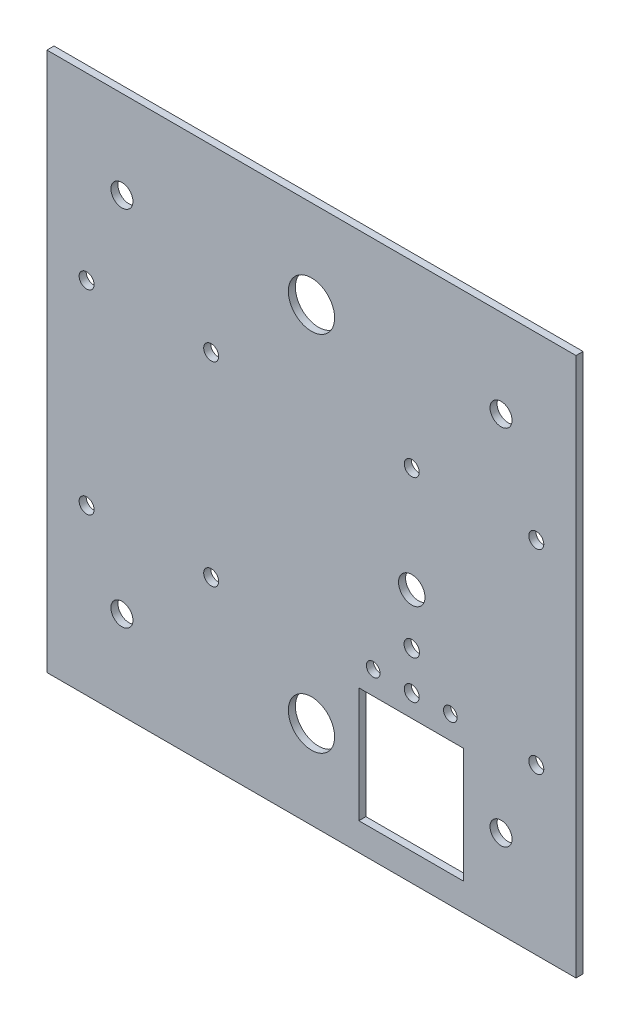
ISO-10303-21;
HEADER;
FILE_DESCRIPTION(('STEP AP214'),'2;1');
FILE_NAME('part.step','',(''),(''),'','','');
FILE_SCHEMA(('AUTOMOTIVE_DESIGN { 1 0 10303 214 1 1 1 1 }'));
ENDSEC;
DATA;
#1=APPLICATION_CONTEXT('core data for automotive mechanical design processes');
#2=APPLICATION_PROTOCOL_DEFINITION('international standard','automotive_design',2000,#1);
#3=PRODUCT_CONTEXT('',#1,'mechanical');
#4=PRODUCT('Part','Part','',(#3));
#5=PRODUCT_RELATED_PRODUCT_CATEGORY('part','',(#4));
#6=PRODUCT_DEFINITION_FORMATION('','',#4);
#7=PRODUCT_DEFINITION_CONTEXT('part definition',#1,'design');
#8=PRODUCT_DEFINITION('design','',#6,#7);
#9=PRODUCT_DEFINITION_SHAPE('','',#8);
#10=(LENGTH_UNIT() NAMED_UNIT(*) SI_UNIT(.MILLI.,.METRE.));
#11=(NAMED_UNIT(*) PLANE_ANGLE_UNIT() SI_UNIT($,.RADIAN.));
#12=(NAMED_UNIT(*) SI_UNIT($,.STERADIAN.) SOLID_ANGLE_UNIT());
#13=UNCERTAINTY_MEASURE_WITH_UNIT(LENGTH_MEASURE(1.E-05),#10,'distance_accuracy_value','');
#14=(GEOMETRIC_REPRESENTATION_CONTEXT(3) GLOBAL_UNCERTAINTY_ASSIGNED_CONTEXT((#13)) GLOBAL_UNIT_ASSIGNED_CONTEXT((#10,
#11,#12)) REPRESENTATION_CONTEXT('',''));
#15=CARTESIAN_POINT('',(0.,0.,0.));
#16=DIRECTION('',(0.,0.,1.));
#17=DIRECTION('',(1.,0.,0.));
#18=AXIS2_PLACEMENT_3D('',#15,#16,#17);
#19=CARTESIAN_POINT('',(-60.,60.,12.));
#20=DIRECTION('',(1.,0.,0.));
#21=DIRECTION('',(0.,-1.,0.));
#22=AXIS2_PLACEMENT_3D('',#19,#20,#21);
#23=PLANE('',#22);
#24=DIRECTION('',(0.,-1.,0.));
#25=VECTOR('',#24,1.);
#26=CARTESIAN_POINT('',(-60.,60.,12.));
#27=LINE('',#26,#25);
#28=CARTESIAN_POINT('',(-60.,91.1415926535898,12.));
#29=VERTEX_POINT('',#28);
#30=CARTESIAN_POINT('',(-60.,-31.1415926535898,12.));
#31=VERTEX_POINT('',#30);
#32=EDGE_CURVE('E177',#29,#31,#27,.T.);
#33=ORIENTED_EDGE('',*,*,#32,.T.);
#34=DIRECTION('',(0.,0.,-1.));
#35=VECTOR('',#34,1.);
#36=CARTESIAN_POINT('',(-60.,-31.1415926535898,12.));
#37=LINE('',#36,#35);
#38=CARTESIAN_POINT('',(-60.,-31.1415926535898,13.6));
#39=VERTEX_POINT('',#38);
#40=EDGE_CURVE('E202',#39,#31,#37,.T.);
#41=ORIENTED_EDGE('',*,*,#40,.F.);
#42=DIRECTION('',(0.,1.,0.));
#43=VECTOR('',#42,1.);
#44=CARTESIAN_POINT('',(-60.,60.,13.6));
#45=LINE('',#44,#43);
#46=CARTESIAN_POINT('',(-60.,91.1415926535898,13.6));
#47=VERTEX_POINT('',#46);
#48=EDGE_CURVE('E299',#47,#39,#45,.F.);
#49=ORIENTED_EDGE('',*,*,#48,.F.);
#50=DIRECTION('',(0.,0.,-1.));
#51=VECTOR('',#50,1.);
#52=CARTESIAN_POINT('',(-60.,91.1415926535898,12.));
#53=LINE('',#52,#51);
#54=EDGE_CURVE('E234',#47,#29,#53,.T.);
#55=ORIENTED_EDGE('',*,*,#54,.T.);
#56=EDGE_LOOP('',(#33,#41,#49,#55));
#57=FACE_BOUND('',#56,.T.);
#58=ADVANCED_FACE('F48',(#57),#23,.F.);
#59=CARTESIAN_POINT('',(60.,60.,12.));
#60=DIRECTION('',(1.,0.,0.));
#61=DIRECTION('',(0.,-1.,0.));
#62=AXIS2_PLACEMENT_3D('',#59,#60,#61);
#63=PLANE('',#62);
#64=DIRECTION('',(0.,-1.,0.));
#65=VECTOR('',#64,1.);
#66=CARTESIAN_POINT('',(60.,60.,12.));
#67=LINE('',#66,#65);
#68=CARTESIAN_POINT('',(60.,91.1415926535898,12.));
#69=VERTEX_POINT('',#68);
#70=CARTESIAN_POINT('',(60.,-31.1415926535898,12.));
#71=VERTEX_POINT('',#70);
#72=EDGE_CURVE('E182',#69,#71,#67,.T.);
#73=ORIENTED_EDGE('',*,*,#72,.F.);
#74=DIRECTION('',(0.,0.,-1.));
#75=VECTOR('',#74,1.);
#76=CARTESIAN_POINT('',(60.,91.1415926535898,12.));
#77=LINE('',#76,#75);
#78=CARTESIAN_POINT('',(60.,91.1415926535898,13.6));
#79=VERTEX_POINT('',#78);
#80=EDGE_CURVE('E267',#79,#69,#77,.T.);
#81=ORIENTED_EDGE('',*,*,#80,.F.);
#82=DIRECTION('',(0.,1.,0.));
#83=VECTOR('',#82,1.);
#84=CARTESIAN_POINT('',(60.,60.,13.6));
#85=LINE('',#84,#83);
#86=CARTESIAN_POINT('',(60.,-31.1415926535898,13.6));
#87=VERTEX_POINT('',#86);
#88=EDGE_CURVE('E287',#79,#87,#85,.F.);
#89=ORIENTED_EDGE('',*,*,#88,.T.);
#90=DIRECTION('',(0.,0.,-1.));
#91=VECTOR('',#90,1.);
#92=CARTESIAN_POINT('',(60.,-31.1415926535898,12.));
#93=LINE('',#92,#91);
#94=EDGE_CURVE('E201',#87,#71,#93,.T.);
#95=ORIENTED_EDGE('',*,*,#94,.T.);
#96=EDGE_LOOP('',(#73,#81,#89,#95));
#97=FACE_BOUND('',#96,.T.);
#98=ADVANCED_FACE('F285',(#97),#63,.T.);
#99=CARTESIAN_POINT('',(51.0000000000001,50.4,12.));
#100=DIRECTION('',(0.,0.,-1.));
#101=DIRECTION('',(-1.,0.,0.));
#102=AXIS2_PLACEMENT_3D('',#99,#100,#101);
#103=CYLINDRICAL_SURFACE('',#102,1.70000000000001);
#104=CARTESIAN_POINT('',(51.0000000000001,50.4,12.));
#105=DIRECTION('',(0.,0.,-1.));
#106=DIRECTION('',(-1.,0.,0.));
#107=AXIS2_PLACEMENT_3D('',#104,#105,#106);
#108=CIRCLE('',#107,1.70000000000001);
#109=CARTESIAN_POINT('',(49.3000000000001,50.4,12.));
#110=VERTEX_POINT('',#109);
#111=EDGE_CURVE('E157',#110,#110,#108,.F.);
#112=ORIENTED_EDGE('',*,*,#111,.F.);
#113=EDGE_LOOP('',(#112));
#114=FACE_BOUND('',#113,.T.);
#115=CARTESIAN_POINT('',(51.0000000000001,50.4,13.6));
#116=DIRECTION('',(0.,0.,-1.));
#117=DIRECTION('',(-1.,0.,0.));
#118=AXIS2_PLACEMENT_3D('',#115,#116,#117);
#119=CIRCLE('',#118,1.70000000000001);
#120=CARTESIAN_POINT('',(49.3000000000001,50.4,13.6));
#121=VERTEX_POINT('',#120);
#122=EDGE_CURVE('E274',#121,#121,#119,.F.);
#123=ORIENTED_EDGE('',*,*,#122,.T.);
#124=EDGE_LOOP('',(#123));
#125=FACE_BOUND('',#124,.T.);
#126=ADVANCED_FACE('F370',(#114,#125),#103,.F.);
#127=CARTESIAN_POINT('',(-22.7499999999999,6.2,12.));
#128=DIRECTION('',(0.,0.,-1.));
#129=DIRECTION('',(-1.,0.,0.));
#130=AXIS2_PLACEMENT_3D('',#127,#128,#129);
#131=CYLINDRICAL_SURFACE('',#130,1.70000000000001);
#132=CARTESIAN_POINT('',(-22.7499999999999,6.2,12.));
#133=DIRECTION('',(0.,0.,1.));
#134=DIRECTION('',(1.,0.,0.));
#135=AXIS2_PLACEMENT_3D('',#132,#133,#134);
#136=CIRCLE('',#135,1.70000000000001);
#137=CARTESIAN_POINT('',(-21.0499999999999,6.2,12.));
#138=VERTEX_POINT('',#137);
#139=EDGE_CURVE('E151',#138,#138,#136,.T.);
#140=ORIENTED_EDGE('',*,*,#139,.F.);
#141=EDGE_LOOP('',(#140));
#142=FACE_BOUND('',#141,.T.);
#143=CARTESIAN_POINT('',(-22.7499999999999,6.2,13.6));
#144=DIRECTION('',(0.,0.,1.));
#145=DIRECTION('',(1.,0.,0.));
#146=AXIS2_PLACEMENT_3D('',#143,#144,#145);
#147=CIRCLE('',#146,1.70000000000001);
#148=CARTESIAN_POINT('',(-21.0499999999999,6.2,13.6));
#149=VERTEX_POINT('',#148);
#150=EDGE_CURVE('E310',#149,#149,#147,.T.);
#151=ORIENTED_EDGE('',*,*,#150,.T.);
#152=EDGE_LOOP('',(#151));
#153=FACE_BOUND('',#152,.T.);
#154=ADVANCED_FACE('F376',(#142,#153),#131,.F.);
#155=CARTESIAN_POINT('',(22.75,6.19999999999998,12.));
#156=DIRECTION('',(0.,0.,-1.));
#157=DIRECTION('',(-1.,0.,0.));
#158=AXIS2_PLACEMENT_3D('',#155,#156,#157);
#159=CYLINDRICAL_SURFACE('',#158,1.70000000000001);
#160=CARTESIAN_POINT('',(22.75,6.19999999999998,12.));
#161=DIRECTION('',(0.,0.,-1.));
#162=DIRECTION('',(-1.,0.,0.));
#163=AXIS2_PLACEMENT_3D('',#160,#161,#162);
#164=CIRCLE('',#163,1.70000000000001);
#165=CARTESIAN_POINT('',(21.05,6.19999999999998,12.));
#166=VERTEX_POINT('',#165);
#167=EDGE_CURVE('E156',#166,#166,#164,.T.);
#168=ORIENTED_EDGE('',*,*,#167,.T.);
#169=EDGE_LOOP('',(#168));
#170=FACE_BOUND('',#169,.T.);
#171=CARTESIAN_POINT('',(22.75,6.19999999999998,13.6));
#172=DIRECTION('',(0.,0.,-1.));
#173=DIRECTION('',(-1.,0.,0.));
#174=AXIS2_PLACEMENT_3D('',#171,#172,#173);
#175=CIRCLE('',#174,1.70000000000001);
#176=CARTESIAN_POINT('',(21.05,6.19999999999998,13.6));
#177=VERTEX_POINT('',#176);
#178=EDGE_CURVE('E313',#177,#177,#175,.T.);
#179=ORIENTED_EDGE('',*,*,#178,.F.);
#180=EDGE_LOOP('',(#179));
#181=FACE_BOUND('',#180,.T.);
#182=ADVANCED_FACE('F380',(#170,#181),#159,.F.);
#183=CARTESIAN_POINT('',(51.0000000000001,6.19999999999998,12.));
#184=DIRECTION('',(0.,0.,-1.));
#185=DIRECTION('',(-1.,0.,0.));
#186=AXIS2_PLACEMENT_3D('',#183,#184,#185);
#187=CYLINDRICAL_SURFACE('',#186,1.70000000000001);
#188=CARTESIAN_POINT('',(51.0000000000001,6.19999999999998,12.));
#189=DIRECTION('',(0.,0.,-1.));
#190=DIRECTION('',(-1.,0.,0.));
#191=AXIS2_PLACEMENT_3D('',#188,#189,#190);
#192=CIRCLE('',#191,1.70000000000001);
#193=CARTESIAN_POINT('',(49.3000000000001,6.19999999999998,12.));
#194=VERTEX_POINT('',#193);
#195=EDGE_CURVE('E163',#194,#194,#192,.T.);
#196=ORIENTED_EDGE('',*,*,#195,.T.);
#197=EDGE_LOOP('',(#196));
#198=FACE_BOUND('',#197,.T.);
#199=CARTESIAN_POINT('',(51.0000000000001,6.19999999999998,13.6));
#200=DIRECTION('',(0.,0.,-1.));
#201=DIRECTION('',(-1.,0.,0.));
#202=AXIS2_PLACEMENT_3D('',#199,#200,#201);
#203=CIRCLE('',#202,1.70000000000001);
#204=CARTESIAN_POINT('',(49.3000000000001,6.19999999999998,13.6));
#205=VERTEX_POINT('',#204);
#206=EDGE_CURVE('E316',#205,#205,#203,.T.);
#207=ORIENTED_EDGE('',*,*,#206,.F.);
#208=EDGE_LOOP('',(#207));
#209=FACE_BOUND('',#208,.T.);
#210=ADVANCED_FACE('F384',(#198,#209),#187,.F.);
#211=CARTESIAN_POINT('',(-51.,50.4,12.));
#212=DIRECTION('',(0.,0.,-1.));
#213=DIRECTION('',(-1.,0.,0.));
#214=AXIS2_PLACEMENT_3D('',#211,#212,#213);
#215=CYLINDRICAL_SURFACE('',#214,1.70000000000001);
#216=CARTESIAN_POINT('',(-51.,50.4,12.));
#217=DIRECTION('',(0.,0.,-1.));
#218=DIRECTION('',(-1.,0.,0.));
#219=AXIS2_PLACEMENT_3D('',#216,#217,#218);
#220=CIRCLE('',#219,1.70000000000001);
#221=CARTESIAN_POINT('',(-52.7,50.4,12.));
#222=VERTEX_POINT('',#221);
#223=EDGE_CURVE('E168',#222,#222,#220,.T.);
#224=ORIENTED_EDGE('',*,*,#223,.T.);
#225=EDGE_LOOP('',(#224));
#226=FACE_BOUND('',#225,.T.);
#227=CARTESIAN_POINT('',(-51.,50.4,13.6));
#228=DIRECTION('',(0.,0.,-1.));
#229=DIRECTION('',(-1.,0.,0.));
#230=AXIS2_PLACEMENT_3D('',#227,#228,#229);
#231=CIRCLE('',#230,1.70000000000001);
#232=CARTESIAN_POINT('',(-52.7,50.4,13.6));
#233=VERTEX_POINT('',#232);
#234=EDGE_CURVE('E319',#233,#233,#231,.T.);
#235=ORIENTED_EDGE('',*,*,#234,.F.);
#236=EDGE_LOOP('',(#235));
#237=FACE_BOUND('',#236,.T.);
#238=ADVANCED_FACE('F388',(#226,#237),#215,.F.);
#239=CARTESIAN_POINT('',(22.75,26.5,12.));
#240=DIRECTION('',(0.,0.,-1.));
#241=DIRECTION('',(-1.,0.,0.));
#242=AXIS2_PLACEMENT_3D('',#239,#240,#241);
#243=CYLINDRICAL_SURFACE('',#242,3.);
#244=CARTESIAN_POINT('',(22.75,26.5,12.));
#245=DIRECTION('',(0.,0.,-1.));
#246=DIRECTION('',(-1.,0.,0.));
#247=AXIS2_PLACEMENT_3D('',#244,#245,#246);
#248=CIRCLE('',#247,3.);
#249=CARTESIAN_POINT('',(19.75,26.5,12.));
#250=VERTEX_POINT('',#249);
#251=EDGE_CURVE('E862',#250,#250,#248,.F.);
#252=ORIENTED_EDGE('',*,*,#251,.F.);
#253=EDGE_LOOP('',(#252));
#254=FACE_BOUND('',#253,.T.);
#255=CARTESIAN_POINT('',(22.75,26.5,13.6));
#256=DIRECTION('',(0.,0.,-1.));
#257=DIRECTION('',(-1.,0.,0.));
#258=AXIS2_PLACEMENT_3D('',#255,#256,#257);
#259=CIRCLE('',#258,3.);
#260=CARTESIAN_POINT('',(19.75,26.5,13.6));
#261=VERTEX_POINT('',#260);
#262=EDGE_CURVE('E322',#261,#261,#259,.F.);
#263=ORIENTED_EDGE('',*,*,#262,.T.);
#264=EDGE_LOOP('',(#263));
#265=FACE_BOUND('',#264,.T.);
#266=ADVANCED_FACE('F392',(#254,#265),#243,.F.);
#267=CARTESIAN_POINT('',(22.75,15.,12.));
#268=DIRECTION('',(0.,0.,-1.));
#269=DIRECTION('',(-1.,0.,0.));
#270=AXIS2_PLACEMENT_3D('',#267,#268,#269);
#271=CYLINDRICAL_SURFACE('',#270,1.75);
#272=CARTESIAN_POINT('',(22.75,15.,12.));
#273=DIRECTION('',(0.,0.,-1.));
#274=DIRECTION('',(-1.,0.,0.));
#275=AXIS2_PLACEMENT_3D('',#272,#273,#274);
#276=CIRCLE('',#275,1.75);
#277=CARTESIAN_POINT('',(21.,15.,12.));
#278=VERTEX_POINT('',#277);
#279=EDGE_CURVE('E859',#278,#278,#276,.F.);
#280=ORIENTED_EDGE('',*,*,#279,.F.);
#281=EDGE_LOOP('',(#280));
#282=FACE_BOUND('',#281,.T.);
#283=CARTESIAN_POINT('',(22.75,15.,13.6));
#284=DIRECTION('',(0.,0.,-1.));
#285=DIRECTION('',(-1.,0.,0.));
#286=AXIS2_PLACEMENT_3D('',#283,#284,#285);
#287=CIRCLE('',#286,1.75);
#288=CARTESIAN_POINT('',(21.,15.,13.6));
#289=VERTEX_POINT('',#288);
#290=EDGE_CURVE('E305',#289,#289,#287,.F.);
#291=ORIENTED_EDGE('',*,*,#290,.T.);
#292=EDGE_LOOP('',(#291));
#293=FACE_BOUND('',#292,.T.);
#294=ADVANCED_FACE('F396',(#282,#293),#271,.F.);
#295=CARTESIAN_POINT('',(14.,6.5,12.));
#296=DIRECTION('',(0.,0.,-1.));
#297=DIRECTION('',(-1.,0.,0.));
#298=AXIS2_PLACEMENT_3D('',#295,#296,#297);
#299=CYLINDRICAL_SURFACE('',#298,1.55);
#300=CARTESIAN_POINT('',(14.,6.5,12.));
#301=DIRECTION('',(0.,0.,-1.));
#302=DIRECTION('',(-1.,0.,0.));
#303=AXIS2_PLACEMENT_3D('',#300,#301,#302);
#304=CIRCLE('',#303,1.55);
#305=CARTESIAN_POINT('',(12.45,6.5,12.));
#306=VERTEX_POINT('',#305);
#307=EDGE_CURVE('E183',#306,#306,#304,.F.);
#308=ORIENTED_EDGE('',*,*,#307,.F.);
#309=EDGE_LOOP('',(#308));
#310=FACE_BOUND('',#309,.T.);
#311=CARTESIAN_POINT('',(14.,6.5,13.6));
#312=DIRECTION('',(0.,0.,-1.));
#313=DIRECTION('',(-1.,0.,0.));
#314=AXIS2_PLACEMENT_3D('',#311,#312,#313);
#315=CIRCLE('',#314,1.55);
#316=CARTESIAN_POINT('',(12.45,6.5,13.6));
#317=VERTEX_POINT('',#316);
#318=EDGE_CURVE('E300',#317,#317,#315,.F.);
#319=ORIENTED_EDGE('',*,*,#318,.T.);
#320=EDGE_LOOP('',(#319));
#321=FACE_BOUND('',#320,.T.);
#322=ADVANCED_FACE('F400',(#310,#321),#299,.F.);
#323=CARTESIAN_POINT('',(31.5,6.50000000000001,12.));
#324=DIRECTION('',(0.,0.,-1.));
#325=DIRECTION('',(-1.,0.,0.));
#326=AXIS2_PLACEMENT_3D('',#323,#324,#325);
#327=CYLINDRICAL_SURFACE('',#326,1.55);
#328=CARTESIAN_POINT('',(31.5,6.50000000000001,12.));
#329=DIRECTION('',(0.,0.,-1.));
#330=DIRECTION('',(-1.,0.,0.));
#331=AXIS2_PLACEMENT_3D('',#328,#329,#330);
#332=CIRCLE('',#331,1.55);
#333=CARTESIAN_POINT('',(29.95,6.50000000000001,12.));
#334=VERTEX_POINT('',#333);
#335=EDGE_CURVE('E188',#334,#334,#332,.T.);
#336=ORIENTED_EDGE('',*,*,#335,.T.);
#337=EDGE_LOOP('',(#336));
#338=FACE_BOUND('',#337,.T.);
#339=CARTESIAN_POINT('',(31.5,6.50000000000001,13.6));
#340=DIRECTION('',(0.,0.,-1.));
#341=DIRECTION('',(-1.,0.,0.));
#342=AXIS2_PLACEMENT_3D('',#339,#340,#341);
#343=CIRCLE('',#342,1.55);
#344=CARTESIAN_POINT('',(29.95,6.50000000000001,13.6));
#345=VERTEX_POINT('',#344);
#346=EDGE_CURVE('E302',#345,#345,#343,.T.);
#347=ORIENTED_EDGE('',*,*,#346,.F.);
#348=EDGE_LOOP('',(#347));
#349=FACE_BOUND('',#348,.T.);
#350=ADVANCED_FACE('F404',(#338,#349),#327,.F.);
#351=CARTESIAN_POINT('',(-22.7499999999999,50.4,12.));
#352=DIRECTION('',(0.,0.,-1.));
#353=DIRECTION('',(-1.,0.,0.));
#354=AXIS2_PLACEMENT_3D('',#351,#352,#353);
#355=CYLINDRICAL_SURFACE('',#354,1.70000000000001);
#356=CARTESIAN_POINT('',(-22.7499999999999,50.4,12.));
#357=DIRECTION('',(0.,0.,-1.));
#358=DIRECTION('',(-1.,0.,0.));
#359=AXIS2_PLACEMENT_3D('',#356,#357,#358);
#360=CIRCLE('',#359,1.70000000000001);
#361=CARTESIAN_POINT('',(-24.4499999999999,50.4,12.));
#362=VERTEX_POINT('',#361);
#363=EDGE_CURVE('E834',#362,#362,#360,.T.);
#364=ORIENTED_EDGE('',*,*,#363,.T.);
#365=EDGE_LOOP('',(#364));
#366=FACE_BOUND('',#365,.T.);
#367=CARTESIAN_POINT('',(-22.7499999999999,50.4,13.6));
#368=DIRECTION('',(0.,0.,-1.));
#369=DIRECTION('',(-1.,0.,0.));
#370=AXIS2_PLACEMENT_3D('',#367,#368,#369);
#371=CIRCLE('',#370,1.70000000000001);
#372=CARTESIAN_POINT('',(-24.4499999999999,50.4,13.6));
#373=VERTEX_POINT('',#372);
#374=EDGE_CURVE('E329',#373,#373,#371,.T.);
#375=ORIENTED_EDGE('',*,*,#374,.F.);
#376=EDGE_LOOP('',(#375));
#377=FACE_BOUND('',#376,.T.);
#378=ADVANCED_FACE('F408',(#366,#377),#355,.F.);
#379=CARTESIAN_POINT('',(22.75,50.4,12.));
#380=DIRECTION('',(0.,0.,-1.));
#381=DIRECTION('',(-1.,0.,0.));
#382=AXIS2_PLACEMENT_3D('',#379,#380,#381);
#383=CYLINDRICAL_SURFACE('',#382,1.70000000000001);
#384=CARTESIAN_POINT('',(22.75,50.4,12.));
#385=DIRECTION('',(0.,0.,-1.));
#386=DIRECTION('',(-1.,0.,0.));
#387=AXIS2_PLACEMENT_3D('',#384,#385,#386);
#388=CIRCLE('',#387,1.70000000000001);
#389=CARTESIAN_POINT('',(21.05,50.4,12.));
#390=VERTEX_POINT('',#389);
#391=EDGE_CURVE('E831',#390,#390,#388,.F.);
#392=ORIENTED_EDGE('',*,*,#391,.F.);
#393=EDGE_LOOP('',(#392));
#394=FACE_BOUND('',#393,.T.);
#395=CARTESIAN_POINT('',(22.75,50.4,13.6));
#396=DIRECTION('',(0.,0.,-1.));
#397=DIRECTION('',(-1.,0.,0.));
#398=AXIS2_PLACEMENT_3D('',#395,#396,#397);
#399=CIRCLE('',#398,1.70000000000001);
#400=CARTESIAN_POINT('',(21.05,50.4,13.6));
#401=VERTEX_POINT('',#400);
#402=EDGE_CURVE('E332',#401,#401,#399,.F.);
#403=ORIENTED_EDGE('',*,*,#402,.T.);
#404=EDGE_LOOP('',(#403));
#405=FACE_BOUND('',#404,.T.);
#406=ADVANCED_FACE('F412',(#394,#405),#383,.F.);
#407=CARTESIAN_POINT('',(-51.,6.2,12.));
#408=DIRECTION('',(0.,0.,-1.));
#409=DIRECTION('',(-1.,0.,0.));
#410=AXIS2_PLACEMENT_3D('',#407,#408,#409);
#411=CYLINDRICAL_SURFACE('',#410,1.70000000000001);
#412=CARTESIAN_POINT('',(-51.,6.2,12.));
#413=DIRECTION('',(0.,0.,1.));
#414=DIRECTION('',(1.,0.,0.));
#415=AXIS2_PLACEMENT_3D('',#412,#413,#414);
#416=CIRCLE('',#415,1.70000000000001);
#417=CARTESIAN_POINT('',(-49.3,6.2,12.));
#418=VERTEX_POINT('',#417);
#419=EDGE_CURVE('E340',#418,#418,#416,.T.);
#420=ORIENTED_EDGE('',*,*,#419,.F.);
#421=EDGE_LOOP('',(#420));
#422=FACE_BOUND('',#421,.T.);
#423=CARTESIAN_POINT('',(-51.,6.2,13.6));
#424=DIRECTION('',(0.,0.,1.));
#425=DIRECTION('',(1.,0.,0.));
#426=AXIS2_PLACEMENT_3D('',#423,#424,#425);
#427=CIRCLE('',#426,1.70000000000001);
#428=CARTESIAN_POINT('',(-49.3,6.2,13.6));
#429=VERTEX_POINT('',#428);
#430=EDGE_CURVE('E335',#429,#429,#427,.T.);
#431=ORIENTED_EDGE('',*,*,#430,.T.);
#432=EDGE_LOOP('',(#431));
#433=FACE_BOUND('',#432,.T.);
#434=ADVANCED_FACE('F415',(#422,#433),#411,.F.);
#435=CARTESIAN_POINT('',(60.,60.,12.));
#436=DIRECTION('',(0.,0.,-1.));
#437=DIRECTION('',(-1.,0.,0.));
#438=AXIS2_PLACEMENT_3D('',#435,#436,#437);
#439=PLANE('',#438);
#440=DIRECTION('',(0.,-1.,0.));
#441=VECTOR('',#440,1.);
#442=CARTESIAN_POINT('',(34.5,1.2292036732051,12.));
#443=LINE('',#442,#441);
#444=CARTESIAN_POINT('',(34.5,1.2292036732051,12.));
#445=VERTEX_POINT('',#444);
#446=CARTESIAN_POINT('',(34.5,-24.8707963267949,12.));
#447=VERTEX_POINT('',#446);
#448=EDGE_CURVE('E63',#445,#447,#443,.T.);
#449=ORIENTED_EDGE('',*,*,#448,.F.);
#450=DIRECTION('',(1.,0.,0.));
#451=VECTOR('',#450,1.);
#452=CARTESIAN_POINT('',(34.5,1.2292036732051,12.));
#453=LINE('',#452,#451);
#454=CARTESIAN_POINT('',(10.75,1.2292036732051,12.));
#455=VERTEX_POINT('',#454);
#456=EDGE_CURVE('E132',#455,#445,#453,.T.);
#457=ORIENTED_EDGE('',*,*,#456,.F.);
#458=DIRECTION('',(0.,1.,0.));
#459=VECTOR('',#458,1.);
#460=CARTESIAN_POINT('',(10.75,1.2292036732051,12.));
#461=LINE('',#460,#459);
#462=CARTESIAN_POINT('',(10.75,-24.8707963267949,12.));
#463=VERTEX_POINT('',#462);
#464=EDGE_CURVE('E116',#463,#455,#461,.T.);
#465=ORIENTED_EDGE('',*,*,#464,.F.);
#466=DIRECTION('',(-1.,0.,0.));
#467=VECTOR('',#466,1.);
#468=CARTESIAN_POINT('',(34.5,-24.8707963267949,12.));
#469=LINE('',#468,#467);
#470=EDGE_CURVE('E125',#447,#463,#469,.T.);
#471=ORIENTED_EDGE('',*,*,#470,.F.);
#472=EDGE_LOOP('',(#449,#457,#465,#471));
#473=FACE_BOUND('',#472,.T.);
#474=ORIENTED_EDGE('',*,*,#111,.T.);
#475=EDGE_LOOP('',(#474));
#476=FACE_BOUND('',#475,.T.);
#477=ORIENTED_EDGE('',*,*,#139,.T.);
#478=EDGE_LOOP('',(#477));
#479=FACE_BOUND('',#478,.T.);
#480=ORIENTED_EDGE('',*,*,#167,.F.);
#481=EDGE_LOOP('',(#480));
#482=FACE_BOUND('',#481,.T.);
#483=ORIENTED_EDGE('',*,*,#195,.F.);
#484=EDGE_LOOP('',(#483));
#485=FACE_BOUND('',#484,.T.);
#486=ORIENTED_EDGE('',*,*,#223,.F.);
#487=EDGE_LOOP('',(#486));
#488=FACE_BOUND('',#487,.T.);
#489=ORIENTED_EDGE('',*,*,#251,.T.);
#490=EDGE_LOOP('',(#489));
#491=FACE_BOUND('',#490,.T.);
#492=ORIENTED_EDGE('',*,*,#279,.T.);
#493=EDGE_LOOP('',(#492));
#494=FACE_BOUND('',#493,.T.);
#495=ORIENTED_EDGE('',*,*,#307,.T.);
#496=EDGE_LOOP('',(#495));
#497=FACE_BOUND('',#496,.T.);
#498=ORIENTED_EDGE('',*,*,#32,.F.);
#499=DIRECTION('',(-1.,0.,0.));
#500=VECTOR('',#499,1.);
#501=CARTESIAN_POINT('',(-60.,91.1415926535898,12.));
#502=LINE('',#501,#500);
#503=EDGE_CURVE('E262',#69,#29,#502,.T.);
#504=ORIENTED_EDGE('',*,*,#503,.F.);
#505=ORIENTED_EDGE('',*,*,#72,.T.);
#506=DIRECTION('',(-1.,0.,0.));
#507=VECTOR('',#506,1.);
#508=CARTESIAN_POINT('',(-60.,-31.1415926535898,12.));
#509=LINE('',#508,#507);
#510=EDGE_CURVE('E195',#71,#31,#509,.T.);
#511=ORIENTED_EDGE('',*,*,#510,.T.);
#512=EDGE_LOOP('',(#498,#504,#505,#511));
#513=FACE_BOUND('',#512,.T.);
#514=ORIENTED_EDGE('',*,*,#335,.F.);
#515=EDGE_LOOP('',(#514));
#516=FACE_BOUND('',#515,.T.);
#517=ORIENTED_EDGE('',*,*,#363,.F.);
#518=EDGE_LOOP('',(#517));
#519=FACE_BOUND('',#518,.T.);
#520=ORIENTED_EDGE('',*,*,#391,.T.);
#521=EDGE_LOOP('',(#520));
#522=FACE_BOUND('',#521,.T.);
#523=ORIENTED_EDGE('',*,*,#419,.T.);
#524=EDGE_LOOP('',(#523));
#525=FACE_BOUND('',#524,.T.);
#526=CARTESIAN_POINT('',(0.,-11.1415926535898,12.));
#527=DIRECTION('',(0.,0.,-1.));
#528=DIRECTION('',(0.,1.,0.));
#529=AXIS2_PLACEMENT_3D('',#526,#527,#528);
#530=CIRCLE('',#529,5.25);
#531=CARTESIAN_POINT('',(0.,-5.8915926535898,12.));
#532=VERTEX_POINT('',#531);
#533=EDGE_CURVE('E209',#532,#532,#530,.T.);
#534=ORIENTED_EDGE('',*,*,#533,.F.);
#535=EDGE_LOOP('',(#534));
#536=FACE_BOUND('',#535,.T.);
#537=CARTESIAN_POINT('',(-43.,-11.1415926535898,12.));
#538=DIRECTION('',(0.,0.,-1.));
#539=DIRECTION('',(0.,1.,0.));
#540=AXIS2_PLACEMENT_3D('',#537,#538,#539);
#541=CIRCLE('',#540,2.5);
#542=CARTESIAN_POINT('',(-43.,-8.6415926535898,12.));
#543=VERTEX_POINT('',#542);
#544=EDGE_CURVE('E214',#543,#543,#541,.T.);
#545=ORIENTED_EDGE('',*,*,#544,.F.);
#546=EDGE_LOOP('',(#545));
#547=FACE_BOUND('',#546,.T.);
#548=CARTESIAN_POINT('',(43.,-11.1415926535898,12.));
#549=DIRECTION('',(0.,0.,-1.));
#550=DIRECTION('',(0.,-1.,0.));
#551=AXIS2_PLACEMENT_3D('',#548,#549,#550);
#552=CIRCLE('',#551,2.5);
#553=CARTESIAN_POINT('',(43.,-13.6415926535898,12.));
#554=VERTEX_POINT('',#553);
#555=EDGE_CURVE('E223',#554,#554,#552,.T.);
#556=ORIENTED_EDGE('',*,*,#555,.F.);
#557=EDGE_LOOP('',(#556));
#558=FACE_BOUND('',#557,.T.);
#559=CARTESIAN_POINT('',(43.,71.1415926535898,12.));
#560=DIRECTION('',(0.,0.,1.));
#561=DIRECTION('',(0.,1.,0.));
#562=AXIS2_PLACEMENT_3D('',#559,#560,#561);
#563=CIRCLE('',#562,2.5);
#564=CARTESIAN_POINT('',(43.,73.6415926535898,12.));
#565=VERTEX_POINT('',#564);
#566=EDGE_CURVE('E250',#565,#565,#563,.T.);
#567=ORIENTED_EDGE('',*,*,#566,.T.);
#568=EDGE_LOOP('',(#567));
#569=FACE_BOUND('',#568,.T.);
#570=CARTESIAN_POINT('',(-43.,71.1415926535898,12.));
#571=DIRECTION('',(0.,0.,1.));
#572=DIRECTION('',(0.,-1.,0.));
#573=AXIS2_PLACEMENT_3D('',#570,#571,#572);
#574=CIRCLE('',#573,2.5);
#575=CARTESIAN_POINT('',(-43.,68.6415926535898,12.));
#576=VERTEX_POINT('',#575);
#577=EDGE_CURVE('E246',#576,#576,#574,.T.);
#578=ORIENTED_EDGE('',*,*,#577,.T.);
#579=EDGE_LOOP('',(#578));
#580=FACE_BOUND('',#579,.T.);
#581=CARTESIAN_POINT('',(0.,71.1415926535898,12.));
#582=DIRECTION('',(0.,0.,1.));
#583=DIRECTION('',(0.,-1.,0.));
#584=AXIS2_PLACEMENT_3D('',#581,#582,#583);
#585=CIRCLE('',#584,5.25);
#586=CARTESIAN_POINT('',(0.,65.8915926535898,12.));
#587=VERTEX_POINT('',#586);
#588=EDGE_CURVE('E239',#587,#587,#585,.T.);
#589=ORIENTED_EDGE('',*,*,#588,.T.);
#590=EDGE_LOOP('',(#589));
#591=FACE_BOUND('',#590,.T.);
#592=ADVANCED_FACE('F50',(#473,#476,#479,#482,#485,#488,#491,#494,#497,#513,#516,#519,#522,#525,
#536,#547,#558,#569,#580,#591),#439,.T.);
#593=CARTESIAN_POINT('',(60.,60.,13.6));
#594=DIRECTION('',(0.,0.,-1.));
#595=DIRECTION('',(-1.,0.,0.));
#596=AXIS2_PLACEMENT_3D('',#593,#594,#595);
#597=PLANE('',#596);
#598=DIRECTION('',(1.,0.,0.));
#599=VECTOR('',#598,1.);
#600=CARTESIAN_POINT('',(60.,1.2292036732051,13.6));
#601=LINE('',#600,#599);
#602=CARTESIAN_POINT('',(10.75,1.2292036732051,13.6));
#603=VERTEX_POINT('',#602);
#604=CARTESIAN_POINT('',(34.5,1.2292036732051,13.6));
#605=VERTEX_POINT('',#604);
#606=EDGE_CURVE('E56',#603,#605,#601,.T.);
#607=ORIENTED_EDGE('',*,*,#606,.T.);
#608=DIRECTION('',(0.,-1.,0.));
#609=VECTOR('',#608,1.);
#610=CARTESIAN_POINT('',(34.5,60.,13.6));
#611=LINE('',#610,#609);
#612=CARTESIAN_POINT('',(34.5,-24.8707963267949,13.6));
#613=VERTEX_POINT('',#612);
#614=EDGE_CURVE('E13',#605,#613,#611,.T.);
#615=ORIENTED_EDGE('',*,*,#614,.T.);
#616=DIRECTION('',(-1.,0.,0.));
#617=VECTOR('',#616,1.);
#618=CARTESIAN_POINT('',(60.,-24.8707963267949,13.6));
#619=LINE('',#618,#617);
#620=CARTESIAN_POINT('',(10.75,-24.8707963267949,13.6));
#621=VERTEX_POINT('',#620);
#622=EDGE_CURVE('E338',#613,#621,#619,.T.);
#623=ORIENTED_EDGE('',*,*,#622,.T.);
#624=DIRECTION('',(0.,1.,0.));
#625=VECTOR('',#624,1.);
#626=CARTESIAN_POINT('',(10.75,60.,13.6));
#627=LINE('',#626,#625);
#628=EDGE_CURVE('E119',#621,#603,#627,.T.);
#629=ORIENTED_EDGE('',*,*,#628,.T.);
#630=EDGE_LOOP('',(#607,#615,#623,#629));
#631=FACE_BOUND('',#630,.T.);
#632=ORIENTED_EDGE('',*,*,#122,.F.);
#633=EDGE_LOOP('',(#632));
#634=FACE_BOUND('',#633,.T.);
#635=ORIENTED_EDGE('',*,*,#150,.F.);
#636=EDGE_LOOP('',(#635));
#637=FACE_BOUND('',#636,.T.);
#638=ORIENTED_EDGE('',*,*,#178,.T.);
#639=EDGE_LOOP('',(#638));
#640=FACE_BOUND('',#639,.T.);
#641=ORIENTED_EDGE('',*,*,#206,.T.);
#642=EDGE_LOOP('',(#641));
#643=FACE_BOUND('',#642,.T.);
#644=ORIENTED_EDGE('',*,*,#234,.T.);
#645=EDGE_LOOP('',(#644));
#646=FACE_BOUND('',#645,.T.);
#647=ORIENTED_EDGE('',*,*,#262,.F.);
#648=EDGE_LOOP('',(#647));
#649=FACE_BOUND('',#648,.T.);
#650=ORIENTED_EDGE('',*,*,#290,.F.);
#651=EDGE_LOOP('',(#650));
#652=FACE_BOUND('',#651,.T.);
#653=ORIENTED_EDGE('',*,*,#318,.F.);
#654=EDGE_LOOP('',(#653));
#655=FACE_BOUND('',#654,.T.);
#656=ORIENTED_EDGE('',*,*,#48,.T.);
#657=DIRECTION('',(1.,0.,0.));
#658=VECTOR('',#657,1.);
#659=CARTESIAN_POINT('',(0.,-31.1415926535898,13.6));
#660=LINE('',#659,#658);
#661=EDGE_CURVE('E206',#87,#39,#660,.F.);
#662=ORIENTED_EDGE('',*,*,#661,.F.);
#663=ORIENTED_EDGE('',*,*,#88,.F.);
#664=DIRECTION('',(-1.,0.,0.));
#665=VECTOR('',#664,1.);
#666=CARTESIAN_POINT('',(0.,91.1415926535898,13.6));
#667=LINE('',#666,#665);
#668=EDGE_CURVE('E227',#79,#47,#667,.T.);
#669=ORIENTED_EDGE('',*,*,#668,.T.);
#670=EDGE_LOOP('',(#656,#662,#663,#669));
#671=FACE_BOUND('',#670,.T.);
#672=ORIENTED_EDGE('',*,*,#346,.T.);
#673=EDGE_LOOP('',(#672));
#674=FACE_BOUND('',#673,.T.);
#675=ORIENTED_EDGE('',*,*,#374,.T.);
#676=EDGE_LOOP('',(#675));
#677=FACE_BOUND('',#676,.T.);
#678=ORIENTED_EDGE('',*,*,#402,.F.);
#679=EDGE_LOOP('',(#678));
#680=FACE_BOUND('',#679,.T.);
#681=ORIENTED_EDGE('',*,*,#430,.F.);
#682=EDGE_LOOP('',(#681));
#683=FACE_BOUND('',#682,.T.);
#684=CARTESIAN_POINT('',(0.,-11.1415926535898,13.6));
#685=DIRECTION('',(0.,0.,-1.));
#686=DIRECTION('',(0.,1.,0.));
#687=AXIS2_PLACEMENT_3D('',#684,#685,#686);
#688=CIRCLE('',#687,5.25);
#689=CARTESIAN_POINT('',(0.,-5.8915926535898,13.6));
#690=VERTEX_POINT('',#689);
#691=EDGE_CURVE('E277',#690,#690,#688,.T.);
#692=ORIENTED_EDGE('',*,*,#691,.T.);
#693=EDGE_LOOP('',(#692));
#694=FACE_BOUND('',#693,.T.);
#695=CARTESIAN_POINT('',(-43.,-11.1415926535898,13.6));
#696=DIRECTION('',(0.,0.,-1.));
#697=DIRECTION('',(0.,1.,0.));
#698=AXIS2_PLACEMENT_3D('',#695,#696,#697);
#699=CIRCLE('',#698,2.5);
#700=CARTESIAN_POINT('',(-43.,-8.6415926535898,13.6));
#701=VERTEX_POINT('',#700);
#702=EDGE_CURVE('E275',#701,#701,#699,.T.);
#703=ORIENTED_EDGE('',*,*,#702,.T.);
#704=EDGE_LOOP('',(#703));
#705=FACE_BOUND('',#704,.T.);
#706=CARTESIAN_POINT('',(43.,-11.1415926535898,13.6));
#707=DIRECTION('',(0.,0.,-1.));
#708=DIRECTION('',(0.,1.,0.));
#709=AXIS2_PLACEMENT_3D('',#706,#707,#708);
#710=CIRCLE('',#709,2.5);
#711=CARTESIAN_POINT('',(43.,-8.6415926535898,13.6));
#712=VERTEX_POINT('',#711);
#713=EDGE_CURVE('E271',#712,#712,#710,.T.);
#714=ORIENTED_EDGE('',*,*,#713,.T.);
#715=EDGE_LOOP('',(#714));
#716=FACE_BOUND('',#715,.T.);
#717=CARTESIAN_POINT('',(43.,71.1415926535898,13.6));
#718=DIRECTION('',(0.,0.,1.));
#719=DIRECTION('',(0.,-1.,0.));
#720=AXIS2_PLACEMENT_3D('',#717,#718,#719);
#721=CIRCLE('',#720,2.5);
#722=CARTESIAN_POINT('',(43.,68.6415926535898,13.6));
#723=VERTEX_POINT('',#722);
#724=EDGE_CURVE('E254',#723,#723,#721,.T.);
#725=ORIENTED_EDGE('',*,*,#724,.F.);
#726=EDGE_LOOP('',(#725));
#727=FACE_BOUND('',#726,.T.);
#728=CARTESIAN_POINT('',(-43.,71.1415926535898,13.6));
#729=DIRECTION('',(0.,0.,1.));
#730=DIRECTION('',(0.,-1.,0.));
#731=AXIS2_PLACEMENT_3D('',#728,#729,#730);
#732=CIRCLE('',#731,2.5);
#733=CARTESIAN_POINT('',(-43.,68.6415926535898,13.6));
#734=VERTEX_POINT('',#733);
#735=EDGE_CURVE('E257',#734,#734,#732,.T.);
#736=ORIENTED_EDGE('',*,*,#735,.F.);
#737=EDGE_LOOP('',(#736));
#738=FACE_BOUND('',#737,.T.);
#739=CARTESIAN_POINT('',(0.,71.1415926535898,13.6));
#740=DIRECTION('',(0.,0.,1.));
#741=DIRECTION('',(0.,-1.,0.));
#742=AXIS2_PLACEMENT_3D('',#739,#740,#741);
#743=CIRCLE('',#742,5.25);
#744=CARTESIAN_POINT('',(0.,65.8915926535898,13.6));
#745=VERTEX_POINT('',#744);
#746=EDGE_CURVE('E260',#745,#745,#743,.T.);
#747=ORIENTED_EDGE('',*,*,#746,.F.);
#748=EDGE_LOOP('',(#747));
#749=FACE_BOUND('',#748,.T.);
#750=ADVANCED_FACE('F343',(#631,#634,#637,#640,#643,#646,#649,#652,#655,#671,#674,#677,#680,
#683,#694,#705,#716,#727,#738,#749),#597,.F.);
#751=CARTESIAN_POINT('',(43.,-11.1415926535898,12.));
#752=DIRECTION('',(0.,0.,1.));
#753=DIRECTION('',(0.,-1.,0.));
#754=AXIS2_PLACEMENT_3D('',#751,#752,#753);
#755=CYLINDRICAL_SURFACE('',#754,2.5);
#756=ORIENTED_EDGE('',*,*,#555,.T.);
#757=EDGE_LOOP('',(#756));
#758=FACE_BOUND('',#757,.T.);
#759=ORIENTED_EDGE('',*,*,#713,.F.);
#760=EDGE_LOOP('',(#759));
#761=FACE_BOUND('',#760,.T.);
#762=ADVANCED_FACE('F428',(#758,#761),#755,.F.);
#763=CARTESIAN_POINT('',(-43.,-11.1415926535898,12.));
#764=DIRECTION('',(0.,0.,1.));
#765=DIRECTION('',(0.,-1.,0.));
#766=AXIS2_PLACEMENT_3D('',#763,#764,#765);
#767=CYLINDRICAL_SURFACE('',#766,2.5);
#768=ORIENTED_EDGE('',*,*,#544,.T.);
#769=EDGE_LOOP('',(#768));
#770=FACE_BOUND('',#769,.T.);
#771=ORIENTED_EDGE('',*,*,#702,.F.);
#772=EDGE_LOOP('',(#771));
#773=FACE_BOUND('',#772,.T.);
#774=ADVANCED_FACE('F454',(#770,#773),#767,.F.);
#775=CARTESIAN_POINT('',(0.,-11.1415926535898,12.));
#776=DIRECTION('',(0.,0.,1.));
#777=DIRECTION('',(0.,-1.,0.));
#778=AXIS2_PLACEMENT_3D('',#775,#776,#777);
#779=CYLINDRICAL_SURFACE('',#778,5.25);
#780=ORIENTED_EDGE('',*,*,#533,.T.);
#781=EDGE_LOOP('',(#780));
#782=FACE_BOUND('',#781,.T.);
#783=ORIENTED_EDGE('',*,*,#691,.F.);
#784=EDGE_LOOP('',(#783));
#785=FACE_BOUND('',#784,.T.);
#786=ADVANCED_FACE('F457',(#782,#785),#779,.F.);
#787=CARTESIAN_POINT('',(-60.,-31.1415926535898,12.));
#788=DIRECTION('',(0.,1.,0.));
#789=DIRECTION('',(-1.,0.,0.));
#790=AXIS2_PLACEMENT_3D('',#787,#788,#789);
#791=PLANE('',#790);
#792=ORIENTED_EDGE('',*,*,#94,.F.);
#793=ORIENTED_EDGE('',*,*,#661,.T.);
#794=ORIENTED_EDGE('',*,*,#40,.T.);
#795=ORIENTED_EDGE('',*,*,#510,.F.);
#796=EDGE_LOOP('',(#792,#793,#794,#795));
#797=FACE_BOUND('',#796,.T.);
#798=ADVANCED_FACE('F290',(#797),#791,.F.);
#799=CARTESIAN_POINT('',(-60.,91.1415926535898,12.));
#800=DIRECTION('',(0.,1.,0.));
#801=DIRECTION('',(-1.,0.,0.));
#802=AXIS2_PLACEMENT_3D('',#799,#800,#801);
#803=PLANE('',#802);
#804=ORIENTED_EDGE('',*,*,#54,.F.);
#805=ORIENTED_EDGE('',*,*,#668,.F.);
#806=ORIENTED_EDGE('',*,*,#80,.T.);
#807=ORIENTED_EDGE('',*,*,#503,.T.);
#808=EDGE_LOOP('',(#804,#805,#806,#807));
#809=FACE_BOUND('',#808,.T.);
#810=ADVANCED_FACE('F297',(#809),#803,.T.);
#811=CARTESIAN_POINT('',(0.,71.1415926535898,12.));
#812=DIRECTION('',(0.,0.,1.));
#813=DIRECTION('',(0.,-1.,0.));
#814=AXIS2_PLACEMENT_3D('',#811,#812,#813);
#815=CYLINDRICAL_SURFACE('',#814,5.25);
#816=ORIENTED_EDGE('',*,*,#588,.F.);
#817=EDGE_LOOP('',(#816));
#818=FACE_BOUND('',#817,.T.);
#819=ORIENTED_EDGE('',*,*,#746,.T.);
#820=EDGE_LOOP('',(#819));
#821=FACE_BOUND('',#820,.T.);
#822=ADVANCED_FACE('F440',(#818,#821),#815,.F.);
#823=CARTESIAN_POINT('',(-43.,71.1415926535898,12.));
#824=DIRECTION('',(0.,0.,1.));
#825=DIRECTION('',(0.,-1.,0.));
#826=AXIS2_PLACEMENT_3D('',#823,#824,#825);
#827=CYLINDRICAL_SURFACE('',#826,2.5);
#828=ORIENTED_EDGE('',*,*,#577,.F.);
#829=EDGE_LOOP('',(#828));
#830=FACE_BOUND('',#829,.T.);
#831=ORIENTED_EDGE('',*,*,#735,.T.);
#832=EDGE_LOOP('',(#831));
#833=FACE_BOUND('',#832,.T.);
#834=ADVANCED_FACE('F360',(#830,#833),#827,.F.);
#835=CARTESIAN_POINT('',(43.,71.1415926535898,12.));
#836=DIRECTION('',(0.,0.,1.));
#837=DIRECTION('',(0.,-1.,0.));
#838=AXIS2_PLACEMENT_3D('',#835,#836,#837);
#839=CYLINDRICAL_SURFACE('',#838,2.5);
#840=ORIENTED_EDGE('',*,*,#566,.F.);
#841=EDGE_LOOP('',(#840));
#842=FACE_BOUND('',#841,.T.);
#843=ORIENTED_EDGE('',*,*,#724,.T.);
#844=EDGE_LOOP('',(#843));
#845=FACE_BOUND('',#844,.T.);
#846=ADVANCED_FACE('F353',(#842,#845),#839,.F.);
#847=CARTESIAN_POINT('',(34.5,1.2292036732051,22.));
#848=DIRECTION('',(1.,0.,0.));
#849=DIRECTION('',(0.,0.,-1.));
#850=AXIS2_PLACEMENT_3D('',#847,#848,#849);
#851=PLANE('',#850);
#852=DIRECTION('',(0.,0.,-1.));
#853=VECTOR('',#852,1.);
#854=CARTESIAN_POINT('',(34.5,1.2292036732051,22.));
#855=LINE('',#854,#853);
#856=EDGE_CURVE('E270',#605,#445,#855,.T.);
#857=ORIENTED_EDGE('',*,*,#856,.T.);
#858=ORIENTED_EDGE('',*,*,#448,.T.);
#859=DIRECTION('',(0.,0.,-1.));
#860=VECTOR('',#859,1.);
#861=CARTESIAN_POINT('',(34.5,-24.8707963267949,22.));
#862=LINE('',#861,#860);
#863=EDGE_CURVE('E122',#613,#447,#862,.T.);
#864=ORIENTED_EDGE('',*,*,#863,.F.);
#865=ORIENTED_EDGE('',*,*,#614,.F.);
#866=EDGE_LOOP('',(#857,#858,#864,#865));
#867=FACE_BOUND('',#866,.T.);
#868=ADVANCED_FACE('F349',(#867),#851,.F.);
#869=CARTESIAN_POINT('',(34.5,1.2292036732051,22.));
#870=DIRECTION('',(0.,1.,0.));
#871=DIRECTION('',(-1.,0.,0.));
#872=AXIS2_PLACEMENT_3D('',#869,#870,#871);
#873=PLANE('',#872);
#874=DIRECTION('',(0.,0.,-1.));
#875=VECTOR('',#874,1.);
#876=CARTESIAN_POINT('',(10.75,1.2292036732051,22.));
#877=LINE('',#876,#875);
#878=EDGE_CURVE('E121',#603,#455,#877,.T.);
#879=ORIENTED_EDGE('',*,*,#878,.T.);
#880=ORIENTED_EDGE('',*,*,#456,.T.);
#881=ORIENTED_EDGE('',*,*,#856,.F.);
#882=ORIENTED_EDGE('',*,*,#606,.F.);
#883=EDGE_LOOP('',(#879,#880,#881,#882));
#884=FACE_BOUND('',#883,.T.);
#885=ADVANCED_FACE('F347',(#884),#873,.F.);
#886=CARTESIAN_POINT('',(10.75,1.2292036732051,22.));
#887=DIRECTION('',(-1.,0.,0.));
#888=DIRECTION('',(0.,0.,1.));
#889=AXIS2_PLACEMENT_3D('',#886,#887,#888);
#890=PLANE('',#889);
#891=DIRECTION('',(0.,0.,-1.));
#892=VECTOR('',#891,1.);
#893=CARTESIAN_POINT('',(10.75,-24.8707963267949,22.));
#894=LINE('',#893,#892);
#895=EDGE_CURVE('E71',#621,#463,#894,.T.);
#896=ORIENTED_EDGE('',*,*,#895,.T.);
#897=ORIENTED_EDGE('',*,*,#464,.T.);
#898=ORIENTED_EDGE('',*,*,#878,.F.);
#899=ORIENTED_EDGE('',*,*,#628,.F.);
#900=EDGE_LOOP('',(#896,#897,#898,#899));
#901=FACE_BOUND('',#900,.T.);
#902=ADVANCED_FACE('F113',(#901),#890,.F.);
#903=CARTESIAN_POINT('',(34.5,-24.8707963267949,22.));
#904=DIRECTION('',(0.,-1.,0.));
#905=DIRECTION('',(0.,0.,-1.));
#906=AXIS2_PLACEMENT_3D('',#903,#904,#905);
#907=PLANE('',#906);
#908=ORIENTED_EDGE('',*,*,#863,.T.);
#909=ORIENTED_EDGE('',*,*,#470,.T.);
#910=ORIENTED_EDGE('',*,*,#895,.F.);
#911=ORIENTED_EDGE('',*,*,#622,.F.);
#912=EDGE_LOOP('',(#908,#909,#910,#911));
#913=FACE_BOUND('',#912,.T.);
#914=ADVANCED_FACE('F126',(#913),#907,.F.);
#915=CLOSED_SHELL('',(#58,#98,#126,#154,#182,#210,#238,#266,#294,#322,#350,#378,#406,#434,#592,
#750,#762,#774,#786,#798,#810,#822,#834,#846,#868,#885,#902,#914));
#916=MANIFOLD_SOLID_BREP('B2',#915);
#917=ADVANCED_BREP_SHAPE_REPRESENTATION('',(#18,#916),#14);
#918=SHAPE_DEFINITION_REPRESENTATION(#9,#917);
ENDSEC;
END-ISO-10303-21;
